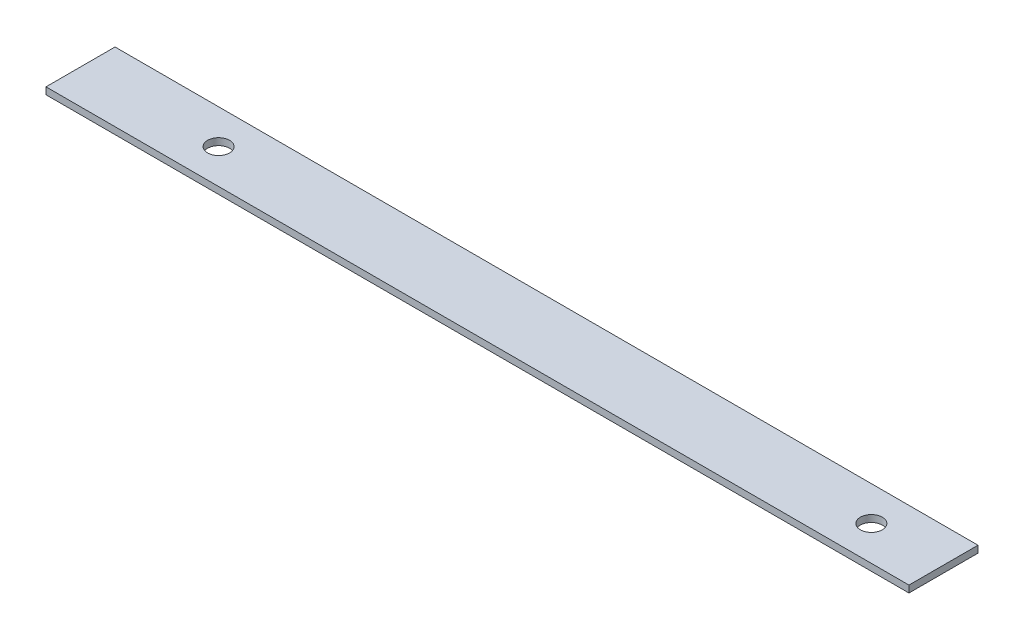
ISO-10303-21;
HEADER;
FILE_DESCRIPTION(('STEP AP214'),'2;1');
FILE_NAME('part.step','',(''),(''),'','','');
FILE_SCHEMA(('AUTOMOTIVE_DESIGN { 1 0 10303 214 1 1 1 1 }'));
ENDSEC;
DATA;
#1=APPLICATION_CONTEXT('core data for automotive mechanical design processes');
#2=APPLICATION_PROTOCOL_DEFINITION('international standard','automotive_design',2000,#1);
#3=PRODUCT_CONTEXT('',#1,'mechanical');
#4=PRODUCT('Part','Part','',(#3));
#5=PRODUCT_RELATED_PRODUCT_CATEGORY('part','',(#4));
#6=PRODUCT_DEFINITION_FORMATION('','',#4);
#7=PRODUCT_DEFINITION_CONTEXT('part definition',#1,'design');
#8=PRODUCT_DEFINITION('design','',#6,#7);
#9=PRODUCT_DEFINITION_SHAPE('','',#8);
#10=(LENGTH_UNIT() NAMED_UNIT(*) SI_UNIT(.MILLI.,.METRE.));
#11=(NAMED_UNIT(*) PLANE_ANGLE_UNIT() SI_UNIT($,.RADIAN.));
#12=(NAMED_UNIT(*) SI_UNIT($,.STERADIAN.) SOLID_ANGLE_UNIT());
#13=UNCERTAINTY_MEASURE_WITH_UNIT(LENGTH_MEASURE(1.E-05),#10,'distance_accuracy_value','');
#14=(GEOMETRIC_REPRESENTATION_CONTEXT(3) GLOBAL_UNCERTAINTY_ASSIGNED_CONTEXT((#13)) GLOBAL_UNIT_ASSIGNED_CONTEXT((#10,
#11,#12)) REPRESENTATION_CONTEXT('',''));
#15=CARTESIAN_POINT('',(0.,0.,0.));
#16=DIRECTION('',(0.,0.,1.));
#17=DIRECTION('',(1.,0.,0.));
#18=AXIS2_PLACEMENT_3D('',#15,#16,#17);
#19=CARTESIAN_POINT('',(175.390966803434,2.,-11.6562372333715));
#20=DIRECTION('',(-1.,0.,0.));
#21=DIRECTION('',(0.,0.,1.));
#22=AXIS2_PLACEMENT_3D('',#19,#20,#21);
#23=PLANE('',#22);
#24=DIRECTION('',(0.,0.,-1.));
#25=VECTOR('',#24,1.);
#26=CARTESIAN_POINT('',(175.390966803434,0.,-11.6562372333715));
#27=LINE('',#26,#25);
#28=CARTESIAN_POINT('',(175.390966803434,0.,8.34376276662852));
#29=VERTEX_POINT('',#28);
#30=CARTESIAN_POINT('',(175.390966803434,0.,-11.6562372333715));
#31=VERTEX_POINT('',#30);
#32=EDGE_CURVE('E96',#29,#31,#27,.T.);
#33=ORIENTED_EDGE('',*,*,#32,.T.);
#34=DIRECTION('',(0.,-1.,0.));
#35=VECTOR('',#34,1.);
#36=CARTESIAN_POINT('',(175.390966803434,2.,-11.6562372333715));
#37=LINE('',#36,#35);
#38=CARTESIAN_POINT('',(175.390966803434,2.,-11.6562372333715));
#39=VERTEX_POINT('',#38);
#40=EDGE_CURVE('E11',#39,#31,#37,.T.);
#41=ORIENTED_EDGE('',*,*,#40,.F.);
#42=DIRECTION('',(0.,0.,-1.));
#43=VECTOR('',#42,1.);
#44=CARTESIAN_POINT('',(175.390966803434,2.,-11.6562372333715));
#45=LINE('',#44,#43);
#46=CARTESIAN_POINT('',(175.390966803434,2.,8.34376276662852));
#47=VERTEX_POINT('',#46);
#48=EDGE_CURVE('E84',#47,#39,#45,.T.);
#49=ORIENTED_EDGE('',*,*,#48,.F.);
#50=DIRECTION('',(0.,-1.,0.));
#51=VECTOR('',#50,1.);
#52=CARTESIAN_POINT('',(175.390966803434,2.,8.34376276662852));
#53=LINE('',#52,#51);
#54=EDGE_CURVE('E92',#47,#29,#53,.T.);
#55=ORIENTED_EDGE('',*,*,#54,.T.);
#56=EDGE_LOOP('',(#33,#41,#49,#55));
#57=FACE_BOUND('',#56,.T.);
#58=ADVANCED_FACE('F33',(#57),#23,.F.);
#59=CARTESIAN_POINT('',(175.390966803434,2.,-11.6562372333715));
#60=DIRECTION('',(0.,0.,1.));
#61=DIRECTION('',(1.,0.,0.));
#62=AXIS2_PLACEMENT_3D('',#59,#60,#61);
#63=PLANE('',#62);
#64=DIRECTION('',(-1.,0.,0.));
#65=VECTOR('',#64,1.);
#66=CARTESIAN_POINT('',(175.390966803434,0.,-11.6562372333715));
#67=LINE('',#66,#65);
#68=CARTESIAN_POINT('',(-74.6090331965661,0.,-11.6562372333715));
#69=VERTEX_POINT('',#68);
#70=EDGE_CURVE('E88',#31,#69,#67,.T.);
#71=ORIENTED_EDGE('',*,*,#70,.T.);
#72=DIRECTION('',(0.,-1.,0.));
#73=VECTOR('',#72,1.);
#74=CARTESIAN_POINT('',(-74.6090331965661,2.,-11.6562372333715));
#75=LINE('',#74,#73);
#76=CARTESIAN_POINT('',(-74.6090331965661,2.,-11.6562372333715));
#77=VERTEX_POINT('',#76);
#78=EDGE_CURVE('E41',#77,#69,#75,.T.);
#79=ORIENTED_EDGE('',*,*,#78,.F.);
#80=DIRECTION('',(-1.,0.,0.));
#81=VECTOR('',#80,1.);
#82=CARTESIAN_POINT('',(175.390966803434,2.,-11.6562372333715));
#83=LINE('',#82,#81);
#84=EDGE_CURVE('E79',#39,#77,#83,.T.);
#85=ORIENTED_EDGE('',*,*,#84,.F.);
#86=ORIENTED_EDGE('',*,*,#40,.T.);
#87=EDGE_LOOP('',(#71,#79,#85,#86));
#88=FACE_BOUND('',#87,.T.);
#89=ADVANCED_FACE('F87',(#88),#63,.F.);
#90=CARTESIAN_POINT('',(-74.6090331965661,2.,-11.6562372333715));
#91=DIRECTION('',(1.,0.,0.));
#92=DIRECTION('',(0.,0.,-1.));
#93=AXIS2_PLACEMENT_3D('',#90,#91,#92);
#94=PLANE('',#93);
#95=DIRECTION('',(0.,0.,1.));
#96=VECTOR('',#95,1.);
#97=CARTESIAN_POINT('',(-74.6090331965661,0.,-11.6562372333715));
#98=LINE('',#97,#96);
#99=CARTESIAN_POINT('',(-74.6090331965661,0.,8.34376276662852));
#100=VERTEX_POINT('',#99);
#101=EDGE_CURVE('E66',#69,#100,#98,.T.);
#102=ORIENTED_EDGE('',*,*,#101,.T.);
#103=DIRECTION('',(0.,-1.,0.));
#104=VECTOR('',#103,1.);
#105=CARTESIAN_POINT('',(-74.6090331965661,2.,8.34376276662852));
#106=LINE('',#105,#104);
#107=CARTESIAN_POINT('',(-74.6090331965661,2.,8.34376276662852));
#108=VERTEX_POINT('',#107);
#109=EDGE_CURVE('E89',#108,#100,#106,.T.);
#110=ORIENTED_EDGE('',*,*,#109,.F.);
#111=DIRECTION('',(0.,0.,1.));
#112=VECTOR('',#111,1.);
#113=CARTESIAN_POINT('',(-74.6090331965661,2.,-11.6562372333715));
#114=LINE('',#113,#112);
#115=EDGE_CURVE('E82',#77,#108,#114,.T.);
#116=ORIENTED_EDGE('',*,*,#115,.F.);
#117=ORIENTED_EDGE('',*,*,#78,.T.);
#118=EDGE_LOOP('',(#102,#110,#116,#117));
#119=FACE_BOUND('',#118,.T.);
#120=ADVANCED_FACE('F90',(#119),#94,.F.);
#121=CARTESIAN_POINT('',(-74.6090331965661,2.,8.34376276662852));
#122=DIRECTION('',(0.,0.,-1.));
#123=DIRECTION('',(-1.,0.,0.));
#124=AXIS2_PLACEMENT_3D('',#121,#122,#123);
#125=PLANE('',#124);
#126=DIRECTION('',(1.,0.,0.));
#127=VECTOR('',#126,1.);
#128=CARTESIAN_POINT('',(-74.6090331965661,0.,8.34376276662852));
#129=LINE('',#128,#127);
#130=EDGE_CURVE('E72',#100,#29,#129,.T.);
#131=ORIENTED_EDGE('',*,*,#130,.T.);
#132=ORIENTED_EDGE('',*,*,#54,.F.);
#133=DIRECTION('',(1.,0.,0.));
#134=VECTOR('',#133,1.);
#135=CARTESIAN_POINT('',(-74.6090331965661,2.,8.34376276662852));
#136=LINE('',#135,#134);
#137=EDGE_CURVE('E49',#108,#47,#136,.T.);
#138=ORIENTED_EDGE('',*,*,#137,.F.);
#139=ORIENTED_EDGE('',*,*,#109,.T.);
#140=EDGE_LOOP('',(#131,#132,#138,#139));
#141=FACE_BOUND('',#140,.T.);
#142=ADVANCED_FACE('F104',(#141),#125,.F.);
#143=CARTESIAN_POINT('',(0.,2.,0.));
#144=DIRECTION('',(0.,1.,0.));
#145=DIRECTION('',(0.,0.,1.));
#146=AXIS2_PLACEMENT_3D('',#143,#144,#145);
#147=PLANE('',#146);
#148=CARTESIAN_POINT('',(154.491966803434,2.,-1.65623723337148));
#149=DIRECTION('',(0.,-1.,0.));
#150=DIRECTION('',(0.,0.,-1.));
#151=AXIS2_PLACEMENT_3D('',#148,#149,#150);
#152=CIRCLE('',#151,3.175);
#153=CARTESIAN_POINT('',(154.491966803434,2.,-4.83123723337148));
#154=VERTEX_POINT('',#153);
#155=EDGE_CURVE('E113',#154,#154,#152,.T.);
#156=ORIENTED_EDGE('',*,*,#155,.T.);
#157=EDGE_LOOP('',(#156));
#158=FACE_BOUND('',#157,.T.);
#159=CARTESIAN_POINT('',(-34.6090331965661,2.,-1.65623723337148));
#160=DIRECTION('',(0.,-1.,0.));
#161=DIRECTION('',(0.,0.,-1.));
#162=AXIS2_PLACEMENT_3D('',#159,#160,#161);
#163=CIRCLE('',#162,3.175);
#164=CARTESIAN_POINT('',(-34.6090331965661,2.,-4.83123723337148));
#165=VERTEX_POINT('',#164);
#166=EDGE_CURVE('E99',#165,#165,#163,.T.);
#167=ORIENTED_EDGE('',*,*,#166,.T.);
#168=EDGE_LOOP('',(#167));
#169=FACE_BOUND('',#168,.T.);
#170=ORIENTED_EDGE('',*,*,#48,.T.);
#171=ORIENTED_EDGE('',*,*,#84,.T.);
#172=ORIENTED_EDGE('',*,*,#115,.T.);
#173=ORIENTED_EDGE('',*,*,#137,.T.);
#174=EDGE_LOOP('',(#170,#171,#172,#173));
#175=FACE_BOUND('',#174,.T.);
#176=ADVANCED_FACE('F80',(#158,#169,#175),#147,.T.);
#177=CARTESIAN_POINT('',(0.,0.,0.));
#178=DIRECTION('',(0.,1.,0.));
#179=DIRECTION('',(0.,0.,1.));
#180=AXIS2_PLACEMENT_3D('',#177,#178,#179);
#181=PLANE('',#180);
#182=CARTESIAN_POINT('',(154.491966803434,0.,-1.65623723337148));
#183=DIRECTION('',(0.,-1.,0.));
#184=DIRECTION('',(0.,0.,-1.));
#185=AXIS2_PLACEMENT_3D('',#182,#183,#184);
#186=CIRCLE('',#185,3.175);
#187=CARTESIAN_POINT('',(154.491966803434,0.,-4.83123723337148));
#188=VERTEX_POINT('',#187);
#189=EDGE_CURVE('E116',#188,#188,#186,.T.);
#190=ORIENTED_EDGE('',*,*,#189,.F.);
#191=EDGE_LOOP('',(#190));
#192=FACE_BOUND('',#191,.T.);
#193=CARTESIAN_POINT('',(-34.6090331965661,0.,-1.65623723337148));
#194=DIRECTION('',(0.,-1.,0.));
#195=DIRECTION('',(0.,0.,-1.));
#196=AXIS2_PLACEMENT_3D('',#193,#194,#195);
#197=CIRCLE('',#196,3.175);
#198=CARTESIAN_POINT('',(-34.6090331965661,0.,-4.83123723337148));
#199=VERTEX_POINT('',#198);
#200=EDGE_CURVE('E110',#199,#199,#197,.T.);
#201=ORIENTED_EDGE('',*,*,#200,.F.);
#202=EDGE_LOOP('',(#201));
#203=FACE_BOUND('',#202,.T.);
#204=ORIENTED_EDGE('',*,*,#32,.F.);
#205=ORIENTED_EDGE('',*,*,#130,.F.);
#206=ORIENTED_EDGE('',*,*,#101,.F.);
#207=ORIENTED_EDGE('',*,*,#70,.F.);
#208=EDGE_LOOP('',(#204,#205,#206,#207));
#209=FACE_BOUND('',#208,.T.);
#210=ADVANCED_FACE('F107',(#192,#203,#209),#181,.F.);
#211=CARTESIAN_POINT('',(-34.6090331965661,2.,-1.65623723337148));
#212=DIRECTION('',(0.,-1.,0.));
#213=DIRECTION('',(0.,0.,-1.));
#214=AXIS2_PLACEMENT_3D('',#211,#212,#213);
#215=CYLINDRICAL_SURFACE('',#214,3.175);
#216=ORIENTED_EDGE('',*,*,#166,.F.);
#217=EDGE_LOOP('',(#216));
#218=FACE_BOUND('',#217,.T.);
#219=ORIENTED_EDGE('',*,*,#200,.T.);
#220=EDGE_LOOP('',(#219));
#221=FACE_BOUND('',#220,.T.);
#222=ADVANCED_FACE('F127',(#218,#221),#215,.F.);
#223=CARTESIAN_POINT('',(154.491966803434,2.,-1.65623723337148));
#224=DIRECTION('',(0.,-1.,0.));
#225=DIRECTION('',(0.,0.,-1.));
#226=AXIS2_PLACEMENT_3D('',#223,#224,#225);
#227=CYLINDRICAL_SURFACE('',#226,3.175);
#228=ORIENTED_EDGE('',*,*,#155,.F.);
#229=EDGE_LOOP('',(#228));
#230=FACE_BOUND('',#229,.T.);
#231=ORIENTED_EDGE('',*,*,#189,.T.);
#232=EDGE_LOOP('',(#231));
#233=FACE_BOUND('',#232,.T.);
#234=ADVANCED_FACE('F124',(#230,#233),#227,.F.);
#235=CLOSED_SHELL('',(#58,#89,#120,#142,#176,#210,#222,#234));
#236=MANIFOLD_SOLID_BREP('B2',#235);
#237=ADVANCED_BREP_SHAPE_REPRESENTATION('',(#18,#236),#14);
#238=SHAPE_DEFINITION_REPRESENTATION(#9,#237);
ENDSEC;
END-ISO-10303-21;
